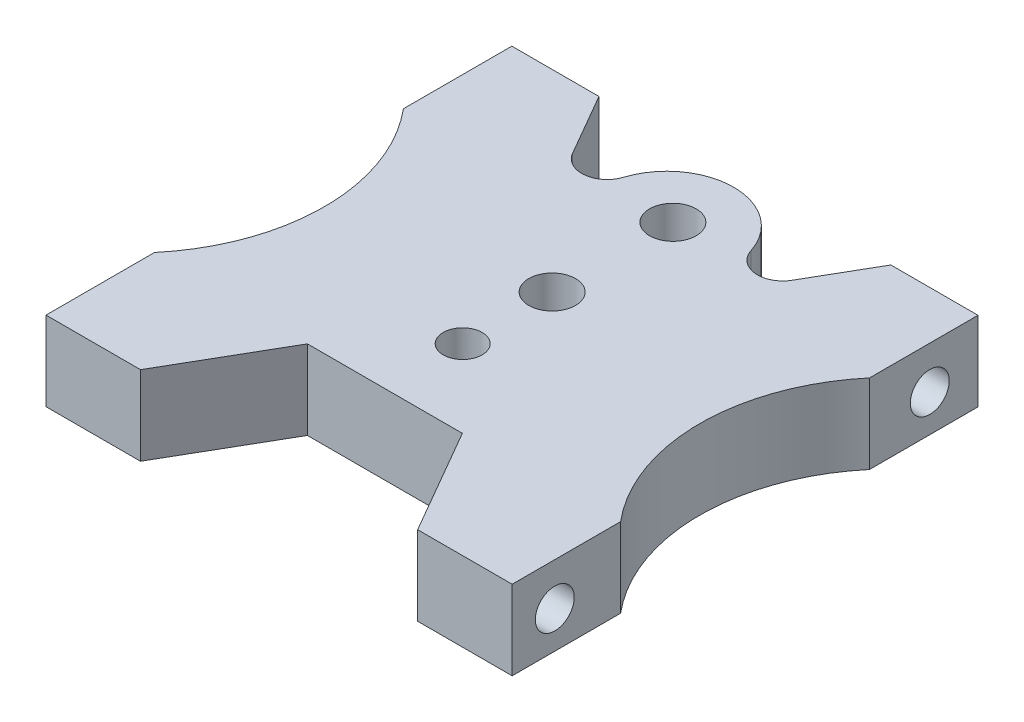
ISO-10303-21;
HEADER;
FILE_DESCRIPTION(('STEP AP214'),'2;1');
FILE_NAME('part.step','',(''),(''),'','','');
FILE_SCHEMA(('AUTOMOTIVE_DESIGN { 1 0 10303 214 1 1 1 1 }'));
ENDSEC;
DATA;
#1=APPLICATION_CONTEXT('core data for automotive mechanical design processes');
#2=APPLICATION_PROTOCOL_DEFINITION('international standard','automotive_design',2000,#1);
#3=PRODUCT_CONTEXT('',#1,'mechanical');
#4=PRODUCT('Part','Part','',(#3));
#5=PRODUCT_RELATED_PRODUCT_CATEGORY('part','',(#4));
#6=PRODUCT_DEFINITION_FORMATION('','',#4);
#7=PRODUCT_DEFINITION_CONTEXT('part definition',#1,'design');
#8=PRODUCT_DEFINITION('design','',#6,#7);
#9=PRODUCT_DEFINITION_SHAPE('','',#8);
#10=(LENGTH_UNIT() NAMED_UNIT(*) SI_UNIT(.MILLI.,.METRE.));
#11=(NAMED_UNIT(*) PLANE_ANGLE_UNIT() SI_UNIT($,.RADIAN.));
#12=(NAMED_UNIT(*) SI_UNIT($,.STERADIAN.) SOLID_ANGLE_UNIT());
#13=UNCERTAINTY_MEASURE_WITH_UNIT(LENGTH_MEASURE(1.E-05),#10,'distance_accuracy_value','');
#14=(GEOMETRIC_REPRESENTATION_CONTEXT(3) GLOBAL_UNCERTAINTY_ASSIGNED_CONTEXT((#13)) GLOBAL_UNIT_ASSIGNED_CONTEXT((#10,
#11,#12)) REPRESENTATION_CONTEXT('',''));
#15=CARTESIAN_POINT('',(0.,0.,0.));
#16=DIRECTION('',(0.,0.,1.));
#17=DIRECTION('',(1.,0.,0.));
#18=AXIS2_PLACEMENT_3D('',#15,#16,#17);
#19=CARTESIAN_POINT('',(-14.98,-5.1,-14.9700000000001));
#20=DIRECTION('',(-1.,0.,0.));
#21=DIRECTION('',(0.,0.,1.));
#22=AXIS2_PLACEMENT_3D('',#19,#20,#21);
#23=PLANE('',#22);
#24=DIRECTION('',(0.,1.,0.));
#25=VECTOR('',#24,1.);
#26=CARTESIAN_POINT('',(-14.98,-5.1,8.));
#27=LINE('',#26,#25);
#28=CARTESIAN_POINT('',(-14.98,-5.1,8.));
#29=VERTEX_POINT('',#28);
#30=CARTESIAN_POINT('',(-14.98,0.,8.));
#31=VERTEX_POINT('',#30);
#32=EDGE_CURVE('E344',#29,#31,#27,.T.);
#33=ORIENTED_EDGE('',*,*,#32,.F.);
#34=DIRECTION('',(0.,0.,1.));
#35=VECTOR('',#34,1.);
#36=CARTESIAN_POINT('',(-14.98,-5.1,-14.9700000000001));
#37=LINE('',#36,#35);
#38=CARTESIAN_POINT('',(-14.98,-5.1,14.9699999999999));
#39=VERTEX_POINT('',#38);
#40=EDGE_CURVE('E232',#29,#39,#37,.T.);
#41=ORIENTED_EDGE('',*,*,#40,.T.);
#42=DIRECTION('',(0.,1.,0.));
#43=VECTOR('',#42,1.);
#44=CARTESIAN_POINT('',(-14.98,-5.1,14.9699999999999));
#45=LINE('',#44,#43);
#46=CARTESIAN_POINT('',(-14.98,0.,14.9699999999999));
#47=VERTEX_POINT('',#46);
#48=EDGE_CURVE('E244',#39,#47,#45,.T.);
#49=ORIENTED_EDGE('',*,*,#48,.T.);
#50=DIRECTION('',(0.,0.,1.));
#51=VECTOR('',#50,1.);
#52=CARTESIAN_POINT('',(-14.98,0.,-14.9700000000001));
#53=LINE('',#52,#51);
#54=EDGE_CURVE('E222',#31,#47,#53,.T.);
#55=ORIENTED_EDGE('',*,*,#54,.F.);
#56=EDGE_LOOP('',(#33,#41,#49,#55));
#57=FACE_BOUND('',#56,.T.);
#58=ADVANCED_FACE('F38',(#57),#23,.T.);
#59=CARTESIAN_POINT('',(-14.98,-5.1,-14.9700000000001));
#60=DIRECTION('',(0.,0.,-1.));
#61=DIRECTION('',(-1.,0.,0.));
#62=AXIS2_PLACEMENT_3D('',#59,#60,#61);
#63=PLANE('',#62);
#64=DIRECTION('',(-1.,0.,0.));
#65=VECTOR('',#64,1.);
#66=CARTESIAN_POINT('',(-14.98,-5.1,-14.9700000000001));
#67=LINE('',#66,#65);
#68=CARTESIAN_POINT('',(14.98,-5.1,-14.9700000000001));
#69=VERTEX_POINT('',#68);
#70=CARTESIAN_POINT('',(9.38,-5.1,-14.9700000000001));
#71=VERTEX_POINT('',#70);
#72=EDGE_CURVE('E241',#69,#71,#67,.T.);
#73=ORIENTED_EDGE('',*,*,#72,.T.);
#74=DIRECTION('',(0.,1.,0.));
#75=VECTOR('',#74,1.);
#76=CARTESIAN_POINT('',(9.38,-5.1,-14.9700000000001));
#77=LINE('',#76,#75);
#78=CARTESIAN_POINT('',(9.38,0.,-14.9700000000001));
#79=VERTEX_POINT('',#78);
#80=EDGE_CURVE('E387',#71,#79,#77,.T.);
#81=ORIENTED_EDGE('',*,*,#80,.T.);
#82=DIRECTION('',(-1.,0.,0.));
#83=VECTOR('',#82,1.);
#84=CARTESIAN_POINT('',(-14.98,0.,-14.9700000000001));
#85=LINE('',#84,#83);
#86=CARTESIAN_POINT('',(14.98,0.,-14.9700000000001));
#87=VERTEX_POINT('',#86);
#88=EDGE_CURVE('E256',#87,#79,#85,.T.);
#89=ORIENTED_EDGE('',*,*,#88,.F.);
#90=DIRECTION('',(0.,1.,0.));
#91=VECTOR('',#90,1.);
#92=CARTESIAN_POINT('',(14.98,-5.1,-14.9700000000001));
#93=LINE('',#92,#91);
#94=EDGE_CURVE('E263',#69,#87,#93,.T.);
#95=ORIENTED_EDGE('',*,*,#94,.F.);
#96=EDGE_LOOP('',(#73,#81,#89,#95));
#97=FACE_BOUND('',#96,.T.);
#98=ADVANCED_FACE('F429',(#97),#63,.T.);
#99=CARTESIAN_POINT('',(0.,-5.1,0.));
#100=DIRECTION('',(0.,1.,0.));
#101=DIRECTION('',(0.,0.,1.));
#102=AXIS2_PLACEMENT_3D('',#99,#100,#101);
#103=PLANE('',#102);
#104=CARTESIAN_POINT('',(0.,-5.1,3.16999999999989));
#105=DIRECTION('',(0.,1.,0.));
#106=DIRECTION('',(0.,0.,1.));
#107=AXIS2_PLACEMENT_3D('',#104,#105,#106);
#108=CIRCLE('',#107,1.25);
#109=CARTESIAN_POINT('',(0.,-5.1,4.41999999999988));
#110=VERTEX_POINT('',#109);
#111=EDGE_CURVE('E325',#110,#110,#108,.T.);
#112=ORIENTED_EDGE('',*,*,#111,.T.);
#113=EDGE_LOOP('',(#112));
#114=FACE_BOUND('',#113,.T.);
#115=CARTESIAN_POINT('',(0.,-5.1,-2.58000000000012));
#116=DIRECTION('',(0.,1.,0.));
#117=DIRECTION('',(0.,0.,1.));
#118=AXIS2_PLACEMENT_3D('',#115,#116,#117);
#119=CIRCLE('',#118,1.5);
#120=CARTESIAN_POINT('',(0.,-5.1,-1.08000000000012));
#121=VERTEX_POINT('',#120);
#122=EDGE_CURVE('E329',#121,#121,#119,.T.);
#123=ORIENTED_EDGE('',*,*,#122,.T.);
#124=EDGE_LOOP('',(#123));
#125=FACE_BOUND('',#124,.T.);
#126=CARTESIAN_POINT('',(0.,-5.1,-10.3400000000001));
#127=DIRECTION('',(0.,1.,0.));
#128=DIRECTION('',(0.,0.,1.));
#129=AXIS2_PLACEMENT_3D('',#126,#127,#128);
#130=CIRCLE('',#129,1.5);
#131=CARTESIAN_POINT('',(0.,-5.1,-8.84000000000012));
#132=VERTEX_POINT('',#131);
#133=EDGE_CURVE('E335',#132,#132,#130,.T.);
#134=ORIENTED_EDGE('',*,*,#133,.T.);
#135=EDGE_LOOP('',(#134));
#136=FACE_BOUND('',#135,.T.);
#137=ORIENTED_EDGE('',*,*,#40,.F.);
#138=CARTESIAN_POINT('',(-24.5002015437393,-5.1,0.));
#139=DIRECTION('',(0.,1.,0.));
#140=DIRECTION('',(0.,0.,1.));
#141=AXIS2_PLACEMENT_3D('',#138,#139,#140);
#142=CIRCLE('',#141,12.4352015437393);
#143=CARTESIAN_POINT('',(-14.98,-5.1,-8.));
#144=VERTEX_POINT('',#143);
#145=EDGE_CURVE('E341',#29,#144,#142,.T.);
#146=ORIENTED_EDGE('',*,*,#145,.T.);
#147=CARTESIAN_POINT('',(-14.98,-5.1,-14.9700000000001));
#148=VERTEX_POINT('',#147);
#149=EDGE_CURVE('E228',#148,#144,#37,.T.);
#150=ORIENTED_EDGE('',*,*,#149,.F.);
#151=CARTESIAN_POINT('',(-9.38,-5.1,-14.9700000000001));
#152=VERTEX_POINT('',#151);
#153=EDGE_CURVE('E240',#152,#148,#67,.T.);
#154=ORIENTED_EDGE('',*,*,#153,.F.);
#155=DIRECTION('',(0.500000000000004,0.,0.866025403784436));
#156=VECTOR('',#155,1.);
#157=CARTESIAN_POINT('',(-0.552799852673358,-5.1,0.319159143748952));
#158=LINE('',#157,#156);
#159=CARTESIAN_POINT('',(-7.0565531100046,-5.1,-10.9456719378402));
#160=VERTEX_POINT('',#159);
#161=EDGE_CURVE('E356',#152,#160,#158,.T.);
#162=ORIENTED_EDGE('',*,*,#161,.T.);
#163=CARTESIAN_POINT('',(-5.64376787135736,-5.1,-11.7613438756803));
#164=DIRECTION('',(0.,1.,0.));
#165=DIRECTION('',(0.,0.,1.));
#166=AXIS2_PLACEMENT_3D('',#163,#164,#165);
#167=CIRCLE('',#166,1.63134387568023);
#168=CARTESIAN_POINT('',(-4.09,-5.1,-11.2642641610902));
#169=VERTEX_POINT('',#168);
#170=EDGE_CURVE('E359',#160,#169,#167,.T.);
#171=ORIENTED_EDGE('',*,*,#170,.T.);
#172=CARTESIAN_POINT('',(0.,-5.1,-9.95579584342725));
#173=DIRECTION('',(0.,1.,0.));
#174=DIRECTION('',(0.,0.,1.));
#175=AXIS2_PLACEMENT_3D('',#172,#173,#174);
#176=CIRCLE('',#175,4.29420415657287);
#177=CARTESIAN_POINT('',(4.09,-5.1,-11.2642641610902));
#178=VERTEX_POINT('',#177);
#179=EDGE_CURVE('E362',#169,#178,#176,.F.);
#180=ORIENTED_EDGE('',*,*,#179,.T.);
#181=CARTESIAN_POINT('',(5.64376787135736,-5.1,-11.7613438756803));
#182=DIRECTION('',(0.,1.,0.));
#183=DIRECTION('',(0.,0.,1.));
#184=AXIS2_PLACEMENT_3D('',#181,#182,#183);
#185=CIRCLE('',#184,1.63134387568023);
#186=CARTESIAN_POINT('',(7.0565531100046,-5.1,-10.9456719378402));
#187=VERTEX_POINT('',#186);
#188=EDGE_CURVE('E351',#187,#178,#185,.F.);
#189=ORIENTED_EDGE('',*,*,#188,.F.);
#190=DIRECTION('',(-0.500000000000004,0.,0.866025403784436));
#191=VECTOR('',#190,1.);
#192=CARTESIAN_POINT('',(0.552799852673358,-5.1,0.319159143748952));
#193=LINE('',#192,#191);
#194=EDGE_CURVE('E353',#71,#187,#193,.T.);
#195=ORIENTED_EDGE('',*,*,#194,.F.);
#196=ORIENTED_EDGE('',*,*,#72,.F.);
#197=DIRECTION('',(0.,0.,-1.));
#198=VECTOR('',#197,1.);
#199=CARTESIAN_POINT('',(14.98,-5.1,-14.9700000000001));
#200=LINE('',#199,#198);
#201=CARTESIAN_POINT('',(14.98,-5.1,-8.));
#202=VERTEX_POINT('',#201);
#203=EDGE_CURVE('E236',#202,#69,#200,.T.);
#204=ORIENTED_EDGE('',*,*,#203,.F.);
#205=CARTESIAN_POINT('',(24.5002015437393,-5.1,0.));
#206=DIRECTION('',(0.,1.,0.));
#207=DIRECTION('',(0.,0.,1.));
#208=AXIS2_PLACEMENT_3D('',#205,#206,#207);
#209=CIRCLE('',#208,12.4352015437393);
#210=CARTESIAN_POINT('',(14.98,-5.1,8.));
#211=VERTEX_POINT('',#210);
#212=EDGE_CURVE('E391',#211,#202,#209,.F.);
#213=ORIENTED_EDGE('',*,*,#212,.F.);
#214=CARTESIAN_POINT('',(14.98,-5.1,14.9699999999999));
#215=VERTEX_POINT('',#214);
#216=EDGE_CURVE('E237',#215,#211,#200,.T.);
#217=ORIENTED_EDGE('',*,*,#216,.F.);
#218=DIRECTION('',(1.,0.,0.));
#219=VECTOR('',#218,1.);
#220=CARTESIAN_POINT('',(-14.98,-5.1,14.9699999999999));
#221=LINE('',#220,#219);
#222=CARTESIAN_POINT('',(8.90598183048943,-5.1,14.9699999999999));
#223=VERTEX_POINT('',#222);
#224=EDGE_CURVE('E231',#223,#215,#221,.T.);
#225=ORIENTED_EDGE('',*,*,#224,.F.);
#226=DIRECTION('',(-0.499999999999998,0.,-0.86602540378444));
#227=VECTOR('',#226,1.);
#228=CARTESIAN_POINT('',(0.197286225540643,-5.1,-0.113903255423295));
#229=LINE('',#228,#227);
#230=CARTESIAN_POINT('',(4.98,-5.1,8.16999999999989));
#231=VERTEX_POINT('',#230);
#232=EDGE_CURVE('E215',#223,#231,#229,.T.);
#233=ORIENTED_EDGE('',*,*,#232,.T.);
#234=DIRECTION('',(1.,0.,0.));
#235=VECTOR('',#234,1.);
#236=CARTESIAN_POINT('',(0.,-5.1,8.16999999999989));
#237=LINE('',#236,#235);
#238=CARTESIAN_POINT('',(-4.98,-5.1,8.16999999999989));
#239=VERTEX_POINT('',#238);
#240=EDGE_CURVE('E400',#239,#231,#237,.T.);
#241=ORIENTED_EDGE('',*,*,#240,.F.);
#242=DIRECTION('',(0.499999999999997,0.,-0.86602540378444));
#243=VECTOR('',#242,1.);
#244=CARTESIAN_POINT('',(-0.197286225540645,-5.1,-0.113903255423296));
#245=LINE('',#244,#243);
#246=CARTESIAN_POINT('',(-8.90598183048943,-5.1,14.9699999999999));
#247=VERTEX_POINT('',#246);
#248=EDGE_CURVE('E227',#247,#239,#245,.T.);
#249=ORIENTED_EDGE('',*,*,#248,.F.);
#250=EDGE_CURVE('E233',#39,#247,#221,.T.);
#251=ORIENTED_EDGE('',*,*,#250,.F.);
#252=EDGE_LOOP('',(#137,#146,#150,#154,#162,#171,#180,#189,#195,#196,#204,#213,#217,#225,#233,
#241,#249,#251));
#253=FACE_BOUND('',#252,.T.);
#254=ADVANCED_FACE('F408',(#114,#125,#136,#253),#103,.F.);
#255=CARTESIAN_POINT('',(0.,0.,0.));
#256=DIRECTION('',(0.,1.,0.));
#257=DIRECTION('',(0.,0.,1.));
#258=AXIS2_PLACEMENT_3D('',#255,#256,#257);
#259=PLANE('',#258);
#260=CARTESIAN_POINT('',(0.,0.,3.16999999999989));
#261=DIRECTION('',(0.,1.,0.));
#262=DIRECTION('',(0.,0.,1.));
#263=AXIS2_PLACEMENT_3D('',#260,#261,#262);
#264=CIRCLE('',#263,1.25);
#265=CARTESIAN_POINT('',(0.,0.,4.41999999999989));
#266=VERTEX_POINT('',#265);
#267=EDGE_CURVE('E318',#266,#266,#264,.T.);
#268=ORIENTED_EDGE('',*,*,#267,.F.);
#269=EDGE_LOOP('',(#268));
#270=FACE_BOUND('',#269,.T.);
#271=CARTESIAN_POINT('',(0.,0.,-2.58000000000012));
#272=DIRECTION('',(0.,1.,0.));
#273=DIRECTION('',(0.,0.,1.));
#274=AXIS2_PLACEMENT_3D('',#271,#272,#273);
#275=CIRCLE('',#274,1.5);
#276=CARTESIAN_POINT('',(0.,0.,-1.08000000000012));
#277=VERTEX_POINT('',#276);
#278=EDGE_CURVE('E328',#277,#277,#275,.T.);
#279=ORIENTED_EDGE('',*,*,#278,.F.);
#280=EDGE_LOOP('',(#279));
#281=FACE_BOUND('',#280,.T.);
#282=CARTESIAN_POINT('',(0.,0.,-10.3400000000001));
#283=DIRECTION('',(0.,1.,0.));
#284=DIRECTION('',(0.,0.,1.));
#285=AXIS2_PLACEMENT_3D('',#282,#283,#284);
#286=CIRCLE('',#285,1.5);
#287=CARTESIAN_POINT('',(0.,0.,-8.84000000000012));
#288=VERTEX_POINT('',#287);
#289=EDGE_CURVE('E332',#288,#288,#286,.T.);
#290=ORIENTED_EDGE('',*,*,#289,.F.);
#291=EDGE_LOOP('',(#290));
#292=FACE_BOUND('',#291,.T.);
#293=CARTESIAN_POINT('',(-24.5002015437393,0.,0.));
#294=DIRECTION('',(0.,1.,0.));
#295=DIRECTION('',(0.,0.,1.));
#296=AXIS2_PLACEMENT_3D('',#293,#294,#295);
#297=CIRCLE('',#296,12.4352015437393);
#298=CARTESIAN_POINT('',(-14.98,0.,-8.));
#299=VERTEX_POINT('',#298);
#300=EDGE_CURVE('E338',#31,#299,#297,.T.);
#301=ORIENTED_EDGE('',*,*,#300,.F.);
#302=ORIENTED_EDGE('',*,*,#54,.T.);
#303=DIRECTION('',(1.,0.,0.));
#304=VECTOR('',#303,1.);
#305=CARTESIAN_POINT('',(-14.98,0.,14.9699999999999));
#306=LINE('',#305,#304);
#307=CARTESIAN_POINT('',(-8.90598183048943,0.,14.9699999999999));
#308=VERTEX_POINT('',#307);
#309=EDGE_CURVE('E249',#47,#308,#306,.T.);
#310=ORIENTED_EDGE('',*,*,#309,.T.);
#311=DIRECTION('',(0.499999999999997,0.,-0.86602540378444));
#312=VECTOR('',#311,1.);
#313=CARTESIAN_POINT('',(-0.197286225540645,0.,-0.113903255423296));
#314=LINE('',#313,#312);
#315=CARTESIAN_POINT('',(-4.98,0.,8.16999999999989));
#316=VERTEX_POINT('',#315);
#317=EDGE_CURVE('E211',#308,#316,#314,.T.);
#318=ORIENTED_EDGE('',*,*,#317,.T.);
#319=DIRECTION('',(1.,0.,0.));
#320=VECTOR('',#319,1.);
#321=CARTESIAN_POINT('',(0.,0.,8.16999999999989));
#322=LINE('',#321,#320);
#323=CARTESIAN_POINT('',(4.98,0.,8.16999999999989));
#324=VERTEX_POINT('',#323);
#325=EDGE_CURVE('E203',#316,#324,#322,.T.);
#326=ORIENTED_EDGE('',*,*,#325,.T.);
#327=DIRECTION('',(-0.499999999999998,0.,-0.86602540378444));
#328=VECTOR('',#327,1.);
#329=CARTESIAN_POINT('',(0.197286225540643,0.,-0.113903255423295));
#330=LINE('',#329,#328);
#331=CARTESIAN_POINT('',(8.90598183048943,0.,14.9699999999999));
#332=VERTEX_POINT('',#331);
#333=EDGE_CURVE('E195',#332,#324,#330,.T.);
#334=ORIENTED_EDGE('',*,*,#333,.F.);
#335=CARTESIAN_POINT('',(14.98,0.,14.9699999999999));
#336=VERTEX_POINT('',#335);
#337=EDGE_CURVE('E248',#332,#336,#306,.T.);
#338=ORIENTED_EDGE('',*,*,#337,.T.);
#339=DIRECTION('',(0.,0.,-1.));
#340=VECTOR('',#339,1.);
#341=CARTESIAN_POINT('',(14.98,0.,-14.9700000000001));
#342=LINE('',#341,#340);
#343=CARTESIAN_POINT('',(14.98,0.,8.));
#344=VERTEX_POINT('',#343);
#345=EDGE_CURVE('E252',#336,#344,#342,.T.);
#346=ORIENTED_EDGE('',*,*,#345,.T.);
#347=CARTESIAN_POINT('',(24.5002015437393,0.,0.));
#348=DIRECTION('',(0.,1.,0.));
#349=DIRECTION('',(0.,0.,1.));
#350=AXIS2_PLACEMENT_3D('',#347,#348,#349);
#351=CIRCLE('',#350,12.4352015437393);
#352=CARTESIAN_POINT('',(14.98,0.,-8.));
#353=VERTEX_POINT('',#352);
#354=EDGE_CURVE('E380',#344,#353,#351,.F.);
#355=ORIENTED_EDGE('',*,*,#354,.T.);
#356=EDGE_CURVE('E251',#353,#87,#342,.T.);
#357=ORIENTED_EDGE('',*,*,#356,.T.);
#358=ORIENTED_EDGE('',*,*,#88,.T.);
#359=DIRECTION('',(-0.500000000000004,0.,0.866025403784436));
#360=VECTOR('',#359,1.);
#361=CARTESIAN_POINT('',(0.552799852673358,0.,0.319159143748952));
#362=LINE('',#361,#360);
#363=CARTESIAN_POINT('',(7.0565531100046,0.,-10.9456719378402));
#364=VERTEX_POINT('',#363);
#365=EDGE_CURVE('E367',#79,#364,#362,.T.);
#366=ORIENTED_EDGE('',*,*,#365,.T.);
#367=CARTESIAN_POINT('',(5.64376787135736,0.,-11.7613438756803));
#368=DIRECTION('',(0.,1.,0.));
#369=DIRECTION('',(0.,0.,1.));
#370=AXIS2_PLACEMENT_3D('',#367,#368,#369);
#371=CIRCLE('',#370,1.63134387568023);
#372=CARTESIAN_POINT('',(4.09,0.,-11.2642641610902));
#373=VERTEX_POINT('',#372);
#374=EDGE_CURVE('E349',#364,#373,#371,.F.);
#375=ORIENTED_EDGE('',*,*,#374,.T.);
#376=CARTESIAN_POINT('',(0.,0.,-9.95579584342725));
#377=DIRECTION('',(0.,1.,0.));
#378=DIRECTION('',(0.,0.,1.));
#379=AXIS2_PLACEMENT_3D('',#376,#377,#378);
#380=CIRCLE('',#379,4.29420415657287);
#381=CARTESIAN_POINT('',(-4.09,0.,-11.2642641610902));
#382=VERTEX_POINT('',#381);
#383=EDGE_CURVE('E354',#382,#373,#380,.F.);
#384=ORIENTED_EDGE('',*,*,#383,.F.);
#385=CARTESIAN_POINT('',(-5.64376787135736,0.,-11.7613438756803));
#386=DIRECTION('',(0.,1.,0.));
#387=DIRECTION('',(0.,0.,1.));
#388=AXIS2_PLACEMENT_3D('',#385,#386,#387);
#389=CIRCLE('',#388,1.63134387568023);
#390=CARTESIAN_POINT('',(-7.0565531100046,0.,-10.9456719378402));
#391=VERTEX_POINT('',#390);
#392=EDGE_CURVE('E373',#391,#382,#389,.T.);
#393=ORIENTED_EDGE('',*,*,#392,.F.);
#394=DIRECTION('',(0.500000000000004,0.,0.866025403784436));
#395=VECTOR('',#394,1.);
#396=CARTESIAN_POINT('',(-0.552799852673358,0.,0.319159143748952));
#397=LINE('',#396,#395);
#398=CARTESIAN_POINT('',(-9.38,0.,-14.9700000000001));
#399=VERTEX_POINT('',#398);
#400=EDGE_CURVE('E370',#399,#391,#397,.T.);
#401=ORIENTED_EDGE('',*,*,#400,.F.);
#402=CARTESIAN_POINT('',(-14.98,0.,-14.9700000000001));
#403=VERTEX_POINT('',#402);
#404=EDGE_CURVE('E255',#399,#403,#85,.T.);
#405=ORIENTED_EDGE('',*,*,#404,.T.);
#406=EDGE_CURVE('E245',#403,#299,#53,.T.);
#407=ORIENTED_EDGE('',*,*,#406,.T.);
#408=EDGE_LOOP('',(#301,#302,#310,#318,#326,#334,#338,#346,#355,#357,#358,#366,#375,#384,#393,
#401,#405,#407));
#409=FACE_BOUND('',#408,.T.);
#410=ADVANCED_FACE('F209',(#270,#281,#292,#409),#259,.T.);
#411=CARTESIAN_POINT('',(14.98,-5.1,-14.9700000000001));
#412=DIRECTION('',(1.,0.,0.));
#413=DIRECTION('',(0.,0.,-1.));
#414=AXIS2_PLACEMENT_3D('',#411,#412,#413);
#415=PLANE('',#414);
#416=CARTESIAN_POINT('',(14.98,-2.72000000000001,-11.8700000000001));
#417=DIRECTION('',(1.,0.,0.));
#418=DIRECTION('',(0.,0.,-1.));
#419=AXIS2_PLACEMENT_3D('',#416,#417,#418);
#420=CIRCLE('',#419,1.24999999999999);
#421=CARTESIAN_POINT('',(14.98,-2.72000000000001,-13.1200000000001));
#422=VERTEX_POINT('',#421);
#423=EDGE_CURVE('E315',#422,#422,#420,.T.);
#424=ORIENTED_EDGE('',*,*,#423,.F.);
#425=EDGE_LOOP('',(#424));
#426=FACE_BOUND('',#425,.T.);
#427=ORIENTED_EDGE('',*,*,#356,.F.);
#428=DIRECTION('',(0.,1.,0.));
#429=VECTOR('',#428,1.);
#430=CARTESIAN_POINT('',(14.98,-5.1,-8.));
#431=LINE('',#430,#429);
#432=EDGE_CURVE('E204',#202,#353,#431,.T.);
#433=ORIENTED_EDGE('',*,*,#432,.F.);
#434=ORIENTED_EDGE('',*,*,#203,.T.);
#435=ORIENTED_EDGE('',*,*,#94,.T.);
#436=EDGE_LOOP('',(#427,#433,#434,#435));
#437=FACE_BOUND('',#436,.T.);
#438=ADVANCED_FACE('F426',(#426,#437),#415,.T.);
#439=CARTESIAN_POINT('',(14.98,-2.72000000000003,12.2299999999999));
#440=DIRECTION('',(1.,0.,0.));
#441=DIRECTION('',(0.,0.,-1.));
#442=AXIS2_PLACEMENT_3D('',#439,#440,#441);
#443=CIRCLE('',#442,1.24999999999999);
#444=CARTESIAN_POINT('',(14.98,-2.72000000000003,10.9799999999999));
#445=VERTEX_POINT('',#444);
#446=EDGE_CURVE('E184',#445,#445,#443,.T.);
#447=ORIENTED_EDGE('',*,*,#446,.F.);
#448=EDGE_LOOP('',(#447));
#449=FACE_BOUND('',#448,.T.);
#450=ORIENTED_EDGE('',*,*,#216,.T.);
#451=DIRECTION('',(0.,1.,0.));
#452=VECTOR('',#451,1.);
#453=CARTESIAN_POINT('',(14.98,-5.1,8.));
#454=LINE('',#453,#452);
#455=EDGE_CURVE('E393',#211,#344,#454,.T.);
#456=ORIENTED_EDGE('',*,*,#455,.T.);
#457=ORIENTED_EDGE('',*,*,#345,.F.);
#458=DIRECTION('',(0.,1.,0.));
#459=VECTOR('',#458,1.);
#460=CARTESIAN_POINT('',(14.98,-5.1,14.9699999999999));
#461=LINE('',#460,#459);
#462=EDGE_CURVE('E266',#215,#336,#461,.T.);
#463=ORIENTED_EDGE('',*,*,#462,.F.);
#464=EDGE_LOOP('',(#450,#456,#457,#463));
#465=FACE_BOUND('',#464,.T.);
#466=ADVANCED_FACE('F417',(#449,#465),#415,.T.);
#467=CARTESIAN_POINT('',(-14.98,-5.1,14.9699999999999));
#468=DIRECTION('',(0.,0.,1.));
#469=DIRECTION('',(1.,0.,0.));
#470=AXIS2_PLACEMENT_3D('',#467,#468,#469);
#471=PLANE('',#470);
#472=ORIENTED_EDGE('',*,*,#250,.T.);
#473=DIRECTION('',(0.,1.,0.));
#474=VECTOR('',#473,1.);
#475=CARTESIAN_POINT('',(-8.90598183048943,-5.1,14.9699999999999));
#476=LINE('',#475,#474);
#477=EDGE_CURVE('E219',#247,#308,#476,.T.);
#478=ORIENTED_EDGE('',*,*,#477,.T.);
#479=ORIENTED_EDGE('',*,*,#309,.F.);
#480=ORIENTED_EDGE('',*,*,#48,.F.);
#481=EDGE_LOOP('',(#472,#478,#479,#480));
#482=FACE_BOUND('',#481,.T.);
#483=ADVANCED_FACE('F459',(#482),#471,.T.);
#484=DIRECTION('',(0.,1.,0.));
#485=VECTOR('',#484,1.);
#486=CARTESIAN_POINT('',(-14.98,-5.1,-8.));
#487=LINE('',#486,#485);
#488=EDGE_CURVE('E346',#144,#299,#487,.T.);
#489=ORIENTED_EDGE('',*,*,#488,.T.);
#490=ORIENTED_EDGE('',*,*,#406,.F.);
#491=DIRECTION('',(0.,1.,0.));
#492=VECTOR('',#491,1.);
#493=CARTESIAN_POINT('',(-14.98,-5.1,-14.9700000000001));
#494=LINE('',#493,#492);
#495=EDGE_CURVE('E259',#148,#403,#494,.T.);
#496=ORIENTED_EDGE('',*,*,#495,.F.);
#497=ORIENTED_EDGE('',*,*,#149,.T.);
#498=EDGE_LOOP('',(#489,#490,#496,#497));
#499=FACE_BOUND('',#498,.T.);
#500=ADVANCED_FACE('F40',(#499),#23,.T.);
#501=DIRECTION('',(0.,1.,0.));
#502=VECTOR('',#501,1.);
#503=CARTESIAN_POINT('',(-9.38,-5.1,-14.9700000000001));
#504=LINE('',#503,#502);
#505=EDGE_CURVE('E385',#152,#399,#504,.T.);
#506=ORIENTED_EDGE('',*,*,#505,.F.);
#507=ORIENTED_EDGE('',*,*,#153,.T.);
#508=ORIENTED_EDGE('',*,*,#495,.T.);
#509=ORIENTED_EDGE('',*,*,#404,.F.);
#510=EDGE_LOOP('',(#506,#507,#508,#509));
#511=FACE_BOUND('',#510,.T.);
#512=ADVANCED_FACE('F447',(#511),#63,.T.);
#513=DIRECTION('',(0.,1.,0.));
#514=VECTOR('',#513,1.);
#515=CARTESIAN_POINT('',(8.90598183048943,-5.1,14.9699999999999));
#516=LINE('',#515,#514);
#517=EDGE_CURVE('E200',#223,#332,#516,.T.);
#518=ORIENTED_EDGE('',*,*,#517,.F.);
#519=ORIENTED_EDGE('',*,*,#224,.T.);
#520=ORIENTED_EDGE('',*,*,#462,.T.);
#521=ORIENTED_EDGE('',*,*,#337,.F.);
#522=EDGE_LOOP('',(#518,#519,#520,#521));
#523=FACE_BOUND('',#522,.T.);
#524=ADVANCED_FACE('F412',(#523),#471,.T.);
#525=CARTESIAN_POINT('',(-0.197286225540645,-5.1,-0.113903255423296));
#526=DIRECTION('',(0.86602540378444,0.,0.499999999999997));
#527=DIRECTION('',(0.499999999999997,0.,-0.86602540378444));
#528=AXIS2_PLACEMENT_3D('',#525,#526,#527);
#529=PLANE('',#528);
#530=ORIENTED_EDGE('',*,*,#317,.F.);
#531=ORIENTED_EDGE('',*,*,#477,.F.);
#532=ORIENTED_EDGE('',*,*,#248,.T.);
#533=DIRECTION('',(0.,1.,0.));
#534=VECTOR('',#533,1.);
#535=CARTESIAN_POINT('',(-4.98,-5.1,8.16999999999989));
#536=LINE('',#535,#534);
#537=EDGE_CURVE('E223',#239,#316,#536,.T.);
#538=ORIENTED_EDGE('',*,*,#537,.T.);
#539=EDGE_LOOP('',(#530,#531,#532,#538));
#540=FACE_BOUND('',#539,.T.);
#541=ADVANCED_FACE('F403',(#540),#529,.T.);
#542=CARTESIAN_POINT('',(0.,-5.1,8.16999999999989));
#543=DIRECTION('',(0.,0.,1.));
#544=DIRECTION('',(1.,0.,0.));
#545=AXIS2_PLACEMENT_3D('',#542,#543,#544);
#546=PLANE('',#545);
#547=ORIENTED_EDGE('',*,*,#325,.F.);
#548=ORIENTED_EDGE('',*,*,#537,.F.);
#549=ORIENTED_EDGE('',*,*,#240,.T.);
#550=DIRECTION('',(0.,1.,0.));
#551=VECTOR('',#550,1.);
#552=CARTESIAN_POINT('',(4.98,-5.1,8.16999999999989));
#553=LINE('',#552,#551);
#554=EDGE_CURVE('E197',#231,#324,#553,.T.);
#555=ORIENTED_EDGE('',*,*,#554,.T.);
#556=EDGE_LOOP('',(#547,#548,#549,#555));
#557=FACE_BOUND('',#556,.T.);
#558=ADVANCED_FACE('F190',(#557),#546,.T.);
#559=CARTESIAN_POINT('',(0.197286225540643,-5.1,-0.113903255423295));
#560=DIRECTION('',(0.86602540378444,0.,-0.499999999999998));
#561=DIRECTION('',(-0.499999999999998,0.,-0.86602540378444));
#562=AXIS2_PLACEMENT_3D('',#559,#560,#561);
#563=PLANE('',#562);
#564=CARTESIAN_POINT('',(20.8632932040427,-2.72000000000003,35.6806708209154));
#565=DIRECTION('',(0.86602540378444,0.,-0.499999999999998));
#566=DIRECTION('',(0.499999999999998,0.,0.86602540378444));
#567=AXIS2_PLACEMENT_3D('',#564,#565,#566);
#568=ELLIPSE('',#567,28.181169172134,6.76015975997536);
#569=CARTESIAN_POINT('',(6.94999999999999,-3.78900773532975,11.5821400909106));
#570=VERTEX_POINT('',#569);
#571=CARTESIAN_POINT('',(6.94999999999999,-1.6509922646703,11.5821400909106));
#572=VERTEX_POINT('',#571);
#573=EDGE_CURVE('E46',#570,#572,#568,.T.);
#574=ORIENTED_EDGE('',*,*,#573,.T.);
#575=CARTESIAN_POINT('',(7.32404209290987,-2.72000000000003,12.2299999999999));
#576=DIRECTION('',(0.86602540378444,0.,-0.499999999999998));
#577=DIRECTION('',(0.499999999999998,0.,0.86602540378444));
#578=AXIS2_PLACEMENT_3D('',#575,#576,#577);
#579=ELLIPSE('',#578,1.44337567297405,1.24999999999999);
#580=EDGE_CURVE('E11',#572,#570,#579,.T.);
#581=ORIENTED_EDGE('',*,*,#580,.T.);
#582=EDGE_LOOP('',(#574,#581));
#583=FACE_BOUND('',#582,.T.);
#584=ORIENTED_EDGE('',*,*,#333,.T.);
#585=ORIENTED_EDGE('',*,*,#554,.F.);
#586=ORIENTED_EDGE('',*,*,#232,.F.);
#587=ORIENTED_EDGE('',*,*,#517,.T.);
#588=EDGE_LOOP('',(#584,#585,#586,#587));
#589=FACE_BOUND('',#588,.T.);
#590=ADVANCED_FACE('F186',(#583,#589),#563,.F.);
#591=CARTESIAN_POINT('',(24.5002015437393,-5.1,0.));
#592=DIRECTION('',(0.,1.,0.));
#593=DIRECTION('',(0.,0.,1.));
#594=AXIS2_PLACEMENT_3D('',#591,#592,#593);
#595=CYLINDRICAL_SURFACE('',#594,12.4352015437393);
#596=ORIENTED_EDGE('',*,*,#354,.F.);
#597=ORIENTED_EDGE('',*,*,#455,.F.);
#598=ORIENTED_EDGE('',*,*,#212,.T.);
#599=ORIENTED_EDGE('',*,*,#432,.T.);
#600=EDGE_LOOP('',(#596,#597,#598,#599));
#601=FACE_BOUND('',#600,.T.);
#602=ADVANCED_FACE('F189',(#601),#595,.F.);
#603=CARTESIAN_POINT('',(5.64376787135736,-5.1,-11.7613438756803));
#604=DIRECTION('',(0.,1.,0.));
#605=DIRECTION('',(0.,0.,1.));
#606=AXIS2_PLACEMENT_3D('',#603,#604,#605);
#607=CYLINDRICAL_SURFACE('',#606,1.63134387568023);
#608=CARTESIAN_POINT('',(7.0565531100046,-3.56149725697932,-10.9456719378402));
#609=CARTESIAN_POINT('',(7.04762562980744,-3.54450987256068,-10.9302079753344));
#610=CARTESIAN_POINT('',(7.03863727456655,-3.52711507841575,-10.9152271623502));
#611=CARTESIAN_POINT('',(7.02066643355186,-3.49157997678899,-10.8862883953294));
#612=CARTESIAN_POINT('',(7.01168399530197,-3.47344176621551,-10.8723278368845));
#613=CARTESIAN_POINT('',(6.99380409218238,-3.43639864949133,-10.8454038445179));
#614=CARTESIAN_POINT('',(6.98490662846076,-3.41749373299996,-10.8324404240516));
#615=CARTESIAN_POINT('',(6.96728679314049,-3.37888277279066,-10.8075017731511));
#616=CARTESIAN_POINT('',(6.95856494939127,-3.35917473451737,-10.7955292589837));
#617=CARTESIAN_POINT('',(6.94999999999999,-3.33909808449737,-10.7840821569882));
#618=B_SPLINE_CURVE_WITH_KNOTS('',3,(#608,#609,#610,#611,#612,#613,#614,#615,#616,#617),
.UNSPECIFIED.,.F.,.F.,(4,2,2,2,4),(0.,0.0739281899810724,0.147660545886286,0.221393896560774,
0.295323095965335),.UNSPECIFIED.);
#619=CARTESIAN_POINT('',(7.0565531100046,-3.56149725697932,-10.9456719378402));
#620=VERTEX_POINT('',#619);
#621=CARTESIAN_POINT('',(6.94999999999999,-3.33909808449737,-10.7840821569882));
#622=VERTEX_POINT('',#621);
#623=EDGE_CURVE('E181',#620,#622,#618,.T.);
#624=ORIENTED_EDGE('',*,*,#623,.F.);
#625=DIRECTION('',(0.,1.,0.));
#626=VECTOR('',#625,1.);
#627=CARTESIAN_POINT('',(7.0565531100046,-5.1,-10.9456719378402));
#628=LINE('',#627,#626);
#629=EDGE_CURVE('E314',#187,#620,#628,.T.);
#630=ORIENTED_EDGE('',*,*,#629,.F.);
#631=ORIENTED_EDGE('',*,*,#188,.T.);
#632=DIRECTION('',(0.,1.,0.));
#633=VECTOR('',#632,1.);
#634=CARTESIAN_POINT('',(4.09,-5.1,-11.2642641610902));
#635=LINE('',#634,#633);
#636=EDGE_CURVE('E378',#178,#373,#635,.T.);
#637=ORIENTED_EDGE('',*,*,#636,.T.);
#638=ORIENTED_EDGE('',*,*,#374,.F.);
#639=CARTESIAN_POINT('',(7.0565531100046,-1.87850274302071,-10.9456719378402));
#640=VERTEX_POINT('',#639);
#641=EDGE_CURVE('E307',#640,#364,#628,.T.);
#642=ORIENTED_EDGE('',*,*,#641,.F.);
#643=CARTESIAN_POINT('',(6.94999999999999,-2.10090191550266,-10.7840821569882));
#644=CARTESIAN_POINT('',(6.95856494939127,-2.08082526548266,-10.7955292589837));
#645=CARTESIAN_POINT('',(6.96728679314049,-2.06111722720937,-10.8075017731511));
#646=CARTESIAN_POINT('',(6.98490662846076,-2.02250626700007,-10.8324404240516));
#647=CARTESIAN_POINT('',(6.99380409218239,-2.0036013505087,-10.8454038445179));
#648=CARTESIAN_POINT('',(7.01168399530197,-1.96655823378452,-10.8723278368845));
#649=CARTESIAN_POINT('',(7.02066643355186,-1.94842002321104,-10.8862883953294));
#650=CARTESIAN_POINT('',(7.03863727456655,-1.91288492158428,-10.9152271623502));
#651=CARTESIAN_POINT('',(7.04762562980744,-1.89549012743935,-10.9302079753344));
#652=CARTESIAN_POINT('',(7.0565531100046,-1.87850274302071,-10.9456719378402));
#653=B_SPLINE_CURVE_WITH_KNOTS('',3,(#643,#644,#645,#646,#647,#648,#649,#650,#651,#652),
.UNSPECIFIED.,.F.,.F.,(4,2,2,2,4),(0.,0.0739291994045624,0.147662550079049,0.221394905984262,
0.295323095965335),.UNSPECIFIED.);
#654=CARTESIAN_POINT('',(6.94999999999999,-2.10090191550266,-10.7840821569882));
#655=VERTEX_POINT('',#654);
#656=EDGE_CURVE('E262',#655,#640,#653,.T.);
#657=ORIENTED_EDGE('',*,*,#656,.F.);
#658=CARTESIAN_POINT('',(7.02530757737844,-3.68880116977237,-10.8938008615268));
#659=CARTESIAN_POINT('',(7.01099060446675,-3.63200556957655,-10.8710310636565));
#660=CARTESIAN_POINT('',(6.99732957502903,-3.57415104064699,-10.8504990768033));
#661=CARTESIAN_POINT('',(6.9718896361765,-3.45664414850252,-10.8137739856937));
#662=CARTESIAN_POINT('',(6.96011168350774,-3.39699088957471,-10.7975830842282));
#663=CARTESIAN_POINT('',(6.9390406419841,-3.27636120268336,-10.7694487157997));
#664=CARTESIAN_POINT('',(6.92974361471612,-3.21538704003778,-10.7574985067642));
#665=CARTESIAN_POINT('',(6.91413048702682,-3.0923920957842,-10.7378102576433));
#666=CARTESIAN_POINT('',(6.90781384364923,-3.03037150694459,-10.7300714502995));
#667=CARTESIAN_POINT('',(6.89841399860518,-2.9036961083404,-10.7186535302738));
#668=CARTESIAN_POINT('',(6.89544067724087,-2.83902049128979,-10.7151121796402));
#669=CARTESIAN_POINT('',(6.89331527319828,-2.70951124336214,-10.7125746546327));
#670=CARTESIAN_POINT('',(6.89416351827413,-2.64467759940863,-10.7135788701063));
#671=CARTESIAN_POINT('',(6.89961665399381,-2.51544125330119,-10.7201210349606));
#672=CARTESIAN_POINT('',(6.90421920623406,-2.45103830805016,-10.7256561622301));
#673=CARTESIAN_POINT('',(6.91684605429672,-2.3231384839855,-10.7412204237622));
#674=CARTESIAN_POINT('',(6.92486976700441,-2.25964145266986,-10.7512487921956));
#675=CARTESIAN_POINT('',(6.94592907098501,-2.12005441819511,-10.7784766395759));
#676=CARTESIAN_POINT('',(6.95968056398292,-2.04428434665012,-10.7967714425499));
#677=CARTESIAN_POINT('',(6.99037922542367,-1.89551947525483,-10.8401546106673));
#678=CARTESIAN_POINT('',(7.00732119144768,-1.82252038664274,-10.8652319447825));
#679=CARTESIAN_POINT('',(7.02530757737844,-1.75119883022765,-10.8938008615268));
#680=B_SPLINE_CURVE_WITH_KNOTS('',3,(#658,#659,#660,#661,#662,#663,#664,#665,#666,#667,#668,
#669,#670,#671,#672,#673,#674,#675,#676,#677,#678,#679),.UNSPECIFIED.,.F.,.F.,(4,2,2,2,2,2,2,2,
2,2,4),(0.,0.188471803072001,0.377039061905672,0.565305169257209,0.753536965669067,
0.947789174390676,1.14205804334244,1.33620600251461,1.53032088363955,1.76735672069099,
2.00400933987017),.UNSPECIFIED.);
#681=EDGE_CURVE('E277',#622,#655,#680,.T.);
#682=ORIENTED_EDGE('',*,*,#681,.F.);
#683=EDGE_LOOP('',(#624,#630,#631,#637,#638,#642,#657,#682));
#684=FACE_BOUND('',#683,.T.);
#685=ADVANCED_FACE('F283',(#684),#607,.F.);
#686=CARTESIAN_POINT('',(0.,-5.1,-9.95579584342725));
#687=DIRECTION('',(0.,1.,0.));
#688=DIRECTION('',(0.,0.,1.));
#689=AXIS2_PLACEMENT_3D('',#686,#687,#688);
#690=CYLINDRICAL_SURFACE('',#689,4.29420415657287);
#691=ORIENTED_EDGE('',*,*,#383,.T.);
#692=ORIENTED_EDGE('',*,*,#636,.F.);
#693=ORIENTED_EDGE('',*,*,#179,.F.);
#694=DIRECTION('',(0.,1.,0.));
#695=VECTOR('',#694,1.);
#696=CARTESIAN_POINT('',(-4.09,-5.1,-11.2642641610902));
#697=LINE('',#696,#695);
#698=EDGE_CURVE('E381',#169,#382,#697,.T.);
#699=ORIENTED_EDGE('',*,*,#698,.T.);
#700=EDGE_LOOP('',(#691,#692,#693,#699));
#701=FACE_BOUND('',#700,.T.);
#702=ADVANCED_FACE('F435',(#701),#690,.T.);
#703=CARTESIAN_POINT('',(-5.64376787135736,-5.1,-11.7613438756803));
#704=DIRECTION('',(0.,1.,0.));
#705=DIRECTION('',(0.,0.,1.));
#706=AXIS2_PLACEMENT_3D('',#703,#704,#705);
#707=CYLINDRICAL_SURFACE('',#706,1.63134387568023);
#708=ORIENTED_EDGE('',*,*,#392,.T.);
#709=ORIENTED_EDGE('',*,*,#698,.F.);
#710=ORIENTED_EDGE('',*,*,#170,.F.);
#711=DIRECTION('',(0.,1.,0.));
#712=VECTOR('',#711,1.);
#713=CARTESIAN_POINT('',(-7.0565531100046,-5.1,-10.9456719378402));
#714=LINE('',#713,#712);
#715=EDGE_CURVE('E383',#160,#391,#714,.T.);
#716=ORIENTED_EDGE('',*,*,#715,.T.);
#717=EDGE_LOOP('',(#708,#709,#710,#716));
#718=FACE_BOUND('',#717,.T.);
#719=ADVANCED_FACE('F440',(#718),#707,.F.);
#720=CARTESIAN_POINT('',(-0.552799852673358,-5.1,0.319159143748952));
#721=DIRECTION('',(-0.866025403784436,0.,0.500000000000004));
#722=DIRECTION('',(0.500000000000004,0.,0.866025403784436));
#723=AXIS2_PLACEMENT_3D('',#720,#721,#722);
#724=PLANE('',#723);
#725=ORIENTED_EDGE('',*,*,#400,.T.);
#726=ORIENTED_EDGE('',*,*,#715,.F.);
#727=ORIENTED_EDGE('',*,*,#161,.F.);
#728=ORIENTED_EDGE('',*,*,#505,.T.);
#729=EDGE_LOOP('',(#725,#726,#727,#728));
#730=FACE_BOUND('',#729,.T.);
#731=ADVANCED_FACE('F443',(#730),#724,.F.);
#732=CARTESIAN_POINT('',(0.552799852673358,-5.1,0.319159143748952));
#733=DIRECTION('',(-0.866025403784436,0.,-0.500000000000004));
#734=DIRECTION('',(-0.500000000000004,0.,0.866025403784436));
#735=AXIS2_PLACEMENT_3D('',#732,#733,#734);
#736=PLANE('',#735);
#737=CARTESIAN_POINT('',(7.59021416551215,-2.72000000000001,-11.8700000000001));
#738=DIRECTION('',(-0.866025403784436,0.,-0.500000000000004));
#739=DIRECTION('',(0.500000000000004,0.,-0.866025403784436));
#740=AXIS2_PLACEMENT_3D('',#737,#738,#739);
#741=ELLIPSE('',#740,1.44337567297406,1.24999999999999);
#742=EDGE_CURVE('E309',#640,#620,#741,.T.);
#743=ORIENTED_EDGE('',*,*,#742,.F.);
#744=ORIENTED_EDGE('',*,*,#641,.T.);
#745=ORIENTED_EDGE('',*,*,#365,.F.);
#746=ORIENTED_EDGE('',*,*,#80,.F.);
#747=ORIENTED_EDGE('',*,*,#194,.T.);
#748=ORIENTED_EDGE('',*,*,#629,.T.);
#749=EDGE_LOOP('',(#743,#744,#745,#746,#747,#748));
#750=FACE_BOUND('',#749,.T.);
#751=ADVANCED_FACE('F312',(#750),#736,.T.);
#752=CARTESIAN_POINT('',(-24.5002015437393,-5.1,0.));
#753=DIRECTION('',(0.,1.,0.));
#754=DIRECTION('',(0.,0.,1.));
#755=AXIS2_PLACEMENT_3D('',#752,#753,#754);
#756=CYLINDRICAL_SURFACE('',#755,12.4352015437393);
#757=ORIENTED_EDGE('',*,*,#300,.T.);
#758=ORIENTED_EDGE('',*,*,#488,.F.);
#759=ORIENTED_EDGE('',*,*,#145,.F.);
#760=ORIENTED_EDGE('',*,*,#32,.T.);
#761=EDGE_LOOP('',(#757,#758,#759,#760));
#762=FACE_BOUND('',#761,.T.);
#763=ADVANCED_FACE('F540',(#762),#756,.F.);
#764=CARTESIAN_POINT('',(0.,-5.1,-10.3400000000001));
#765=DIRECTION('',(0.,1.,0.));
#766=DIRECTION('',(0.,0.,1.));
#767=AXIS2_PLACEMENT_3D('',#764,#765,#766);
#768=CYLINDRICAL_SURFACE('',#767,1.5);
#769=ORIENTED_EDGE('',*,*,#133,.F.);
#770=EDGE_LOOP('',(#769));
#771=FACE_BOUND('',#770,.T.);
#772=ORIENTED_EDGE('',*,*,#289,.T.);
#773=EDGE_LOOP('',(#772));
#774=FACE_BOUND('',#773,.T.);
#775=ADVANCED_FACE('F546',(#771,#774),#768,.F.);
#776=CARTESIAN_POINT('',(0.,-5.1,-2.58000000000012));
#777=DIRECTION('',(0.,1.,0.));
#778=DIRECTION('',(0.,0.,1.));
#779=AXIS2_PLACEMENT_3D('',#776,#777,#778);
#780=CYLINDRICAL_SURFACE('',#779,1.5);
#781=ORIENTED_EDGE('',*,*,#122,.F.);
#782=EDGE_LOOP('',(#781));
#783=FACE_BOUND('',#782,.T.);
#784=ORIENTED_EDGE('',*,*,#278,.T.);
#785=EDGE_LOOP('',(#784));
#786=FACE_BOUND('',#785,.T.);
#787=ADVANCED_FACE('F553',(#783,#786),#780,.F.);
#788=CARTESIAN_POINT('',(0.,0.,3.16999999999989));
#789=DIRECTION('',(0.,1.,0.));
#790=DIRECTION('',(0.,0.,1.));
#791=AXIS2_PLACEMENT_3D('',#788,#789,#790);
#792=CYLINDRICAL_SURFACE('',#791,1.25);
#793=ORIENTED_EDGE('',*,*,#111,.F.);
#794=EDGE_LOOP('',(#793));
#795=FACE_BOUND('',#794,.T.);
#796=ORIENTED_EDGE('',*,*,#267,.T.);
#797=EDGE_LOOP('',(#796));
#798=FACE_BOUND('',#797,.T.);
#799=ADVANCED_FACE('F561',(#795,#798),#792,.F.);
#800=CARTESIAN_POINT('',(6.94999999999999,-2.72000000000001,-11.8700000000001));
#801=DIRECTION('',(1.,0.,0.));
#802=DIRECTION('',(0.,0.,-1.));
#803=AXIS2_PLACEMENT_3D('',#800,#801,#802);
#804=CONICAL_SURFACE('',#803,1.25,1.02974425867665);
#805=ORIENTED_EDGE('',*,*,#681,.T.);
#806=CARTESIAN_POINT('',(6.94999999999999,-2.72000000000001,-11.8700000000001));
#807=DIRECTION('',(1.,0.,0.));
#808=DIRECTION('',(0.,0.,-1.));
#809=AXIS2_PLACEMENT_3D('',#806,#807,#808);
#810=CIRCLE('',#809,1.25);
#811=EDGE_CURVE('E60',#655,#622,#810,.T.);
#812=ORIENTED_EDGE('',*,*,#811,.T.);
#813=EDGE_LOOP('',(#805,#812));
#814=FACE_BOUND('',#813,.T.);
#815=ADVANCED_FACE('F291',(#814),#804,.F.);
#816=CARTESIAN_POINT('',(16.95,-2.72000000000001,-11.8700000000001));
#817=DIRECTION('',(1.,0.,0.));
#818=DIRECTION('',(0.,0.,-1.));
#819=AXIS2_PLACEMENT_3D('',#816,#817,#818);
#820=CYLINDRICAL_SURFACE('',#819,1.24999999999999);
#821=ORIENTED_EDGE('',*,*,#423,.T.);
#822=EDGE_LOOP('',(#821));
#823=FACE_BOUND('',#822,.T.);
#824=ORIENTED_EDGE('',*,*,#623,.T.);
#825=ORIENTED_EDGE('',*,*,#811,.F.);
#826=ORIENTED_EDGE('',*,*,#656,.T.);
#827=ORIENTED_EDGE('',*,*,#742,.T.);
#828=EDGE_LOOP('',(#824,#825,#826,#827));
#829=FACE_BOUND('',#828,.T.);
#830=ADVANCED_FACE('F287',(#823,#829),#820,.F.);
#831=CARTESIAN_POINT('',(16.95,-2.72000000000003,12.2299999999999));
#832=DIRECTION('',(1.,0.,0.));
#833=DIRECTION('',(0.,0.,-1.));
#834=AXIS2_PLACEMENT_3D('',#831,#832,#833);
#835=CYLINDRICAL_SURFACE('',#834,1.24999999999999);
#836=ORIENTED_EDGE('',*,*,#446,.T.);
#837=EDGE_LOOP('',(#836));
#838=FACE_BOUND('',#837,.T.);
#839=CARTESIAN_POINT('',(6.94999999999999,-2.72000000000003,12.2299999999999));
#840=DIRECTION('',(1.,0.,0.));
#841=DIRECTION('',(0.,0.,-1.));
#842=AXIS2_PLACEMENT_3D('',#839,#840,#841);
#843=CIRCLE('',#842,1.25);
#844=EDGE_CURVE('E52',#570,#572,#843,.T.);
#845=ORIENTED_EDGE('',*,*,#844,.F.);
#846=ORIENTED_EDGE('',*,*,#580,.F.);
#847=EDGE_LOOP('',(#845,#846));
#848=FACE_BOUND('',#847,.T.);
#849=ADVANCED_FACE('F183',(#838,#848),#835,.F.);
#850=CARTESIAN_POINT('',(6.94999999999999,-2.72000000000003,12.2299999999999));
#851=DIRECTION('',(1.,0.,0.));
#852=DIRECTION('',(0.,0.,-1.));
#853=AXIS2_PLACEMENT_3D('',#850,#851,#852);
#854=CONICAL_SURFACE('',#853,1.25,1.02974425867665);
#855=ORIENTED_EDGE('',*,*,#844,.T.);
#856=ORIENTED_EDGE('',*,*,#573,.F.);
#857=EDGE_LOOP('',(#855,#856));
#858=FACE_BOUND('',#857,.T.);
#859=ADVANCED_FACE('F179',(#858),#854,.F.);
#860=CLOSED_SHELL('',(#58,#98,#254,#410,#438,#466,#483,#500,#512,#524,#541,#558,#590,#602,#685,
#702,#719,#731,#751,#763,#775,#787,#799,#815,#830,#849,#859));
#861=MANIFOLD_SOLID_BREP('B2',#860);
#862=ADVANCED_BREP_SHAPE_REPRESENTATION('',(#18,#861),#14);
#863=SHAPE_DEFINITION_REPRESENTATION(#9,#862);
ENDSEC;
END-ISO-10303-21;
